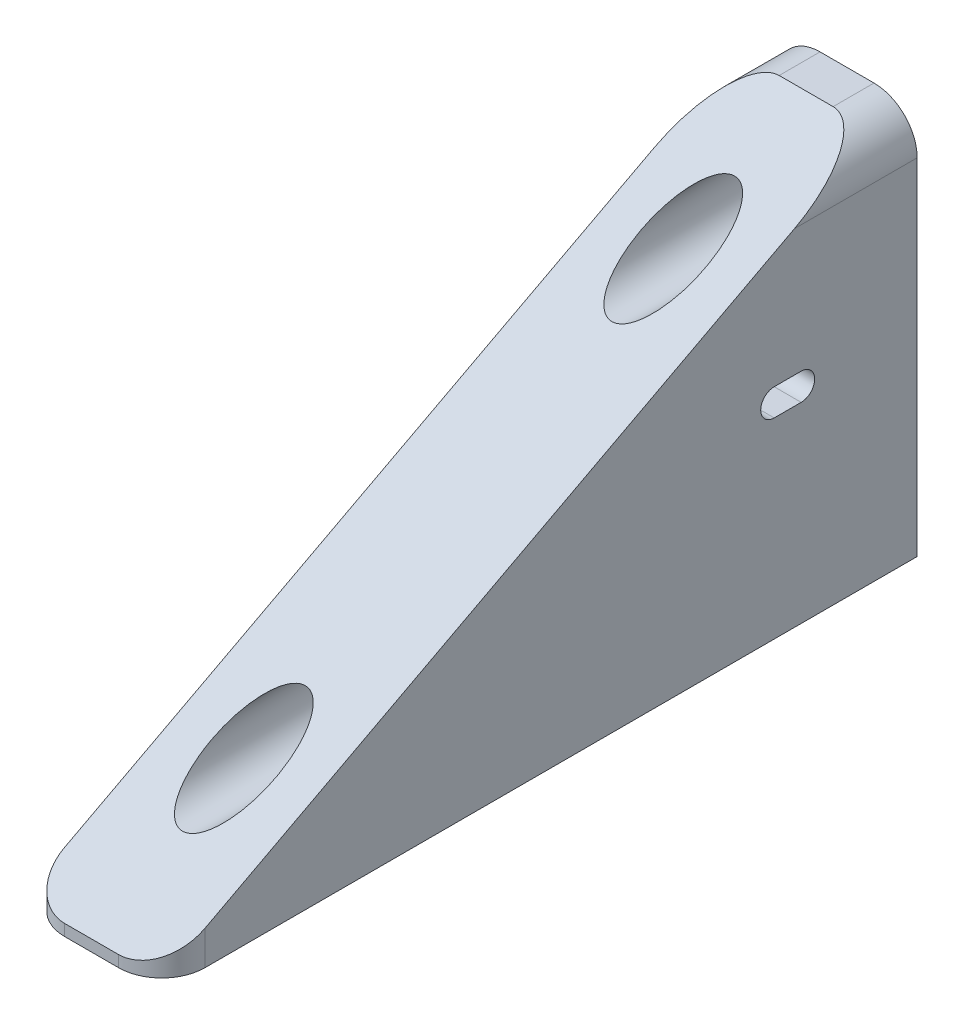
ISO-10303-21;
HEADER;
FILE_DESCRIPTION(('STEP AP214'),'2;1');
FILE_NAME('part.step','',(''),(''),'','','');
FILE_SCHEMA(('AUTOMOTIVE_DESIGN { 1 0 10303 214 1 1 1 1 }'));
ENDSEC;
DATA;
#1=APPLICATION_CONTEXT('core data for automotive mechanical design processes');
#2=APPLICATION_PROTOCOL_DEFINITION('international standard','automotive_design',2000,#1);
#3=PRODUCT_CONTEXT('',#1,'mechanical');
#4=PRODUCT('Part','Part','',(#3));
#5=PRODUCT_RELATED_PRODUCT_CATEGORY('part','',(#4));
#6=PRODUCT_DEFINITION_FORMATION('','',#4);
#7=PRODUCT_DEFINITION_CONTEXT('part definition',#1,'design');
#8=PRODUCT_DEFINITION('design','',#6,#7);
#9=PRODUCT_DEFINITION_SHAPE('','',#8);
#10=(LENGTH_UNIT() NAMED_UNIT(*) SI_UNIT(.MILLI.,.METRE.));
#11=(NAMED_UNIT(*) PLANE_ANGLE_UNIT() SI_UNIT($,.RADIAN.));
#12=(NAMED_UNIT(*) SI_UNIT($,.STERADIAN.) SOLID_ANGLE_UNIT());
#13=UNCERTAINTY_MEASURE_WITH_UNIT(LENGTH_MEASURE(1.E-05),#10,'distance_accuracy_value','');
#14=(GEOMETRIC_REPRESENTATION_CONTEXT(3) GLOBAL_UNCERTAINTY_ASSIGNED_CONTEXT((#13)) GLOBAL_UNIT_ASSIGNED_CONTEXT((#10,
#11,#12)) REPRESENTATION_CONTEXT('',''));
#15=CARTESIAN_POINT('',(0.,0.,0.));
#16=DIRECTION('',(0.,0.,1.));
#17=DIRECTION('',(1.,0.,0.));
#18=AXIS2_PLACEMENT_3D('',#15,#16,#17);
#19=CARTESIAN_POINT('',(6.5,-19.,72.));
#20=DIRECTION('',(0.,-0.884384752846969,-0.466758619558123));
#21=DIRECTION('',(0.,0.466758619558123,-0.88438475284697));
#22=AXIS2_PLACEMENT_3D('',#19,#20,#21);
#23=PLANE('',#22);
#24=DIRECTION('',(-1.,0.,0.));
#25=VECTOR('',#24,1.);
#26=CARTESIAN_POINT('',(6.5,17.,3.78947368421051));
#27=LINE('',#26,#25);
#28=CARTESIAN_POINT('',(2.5,17.,3.78947368421051));
#29=VERTEX_POINT('',#28);
#30=CARTESIAN_POINT('',(-2.5,17.,3.78947368421051));
#31=VERTEX_POINT('',#30);
#32=EDGE_CURVE('E225',#29,#31,#27,.T.);
#33=ORIENTED_EDGE('',*,*,#32,.T.);
#34=CARTESIAN_POINT('',(-2.5,13.,11.3684210526316));
#35=DIRECTION('',(0.,-0.884384752846969,-0.466758619558123));
#36=DIRECTION('',(0.,-0.466758619558123,0.88438475284697));
#37=AXIS2_PLACEMENT_3D('',#34,#35,#36);
#38=ELLIPSE('',#37,8.56973997349375,4.);
#39=CARTESIAN_POINT('',(-6.5,13.,11.3684210526316));
#40=VERTEX_POINT('',#39);
#41=EDGE_CURVE('E254',#31,#40,#38,.F.);
#42=ORIENTED_EDGE('',*,*,#41,.T.);
#43=DIRECTION('',(0.,-0.466758619558123,0.88438475284697));
#44=VECTOR('',#43,1.);
#45=CARTESIAN_POINT('',(-6.5,-19.,72.));
#46=LINE('',#45,#44);
#47=CARTESIAN_POINT('',(-6.5,-15.8333333333334,66.0000000000001));
#48=VERTEX_POINT('',#47);
#49=EDGE_CURVE('E190',#40,#48,#46,.T.);
#50=ORIENTED_EDGE('',*,*,#49,.T.);
#51=CARTESIAN_POINT('',(-2.5,-15.8333333333334,66.0000000000001));
#52=DIRECTION('',(0.,-0.884384752846969,-0.466758619558123));
#53=DIRECTION('',(0.,-0.466758619558123,0.88438475284697));
#54=AXIS2_PLACEMENT_3D('',#51,#52,#53);
#55=ELLIPSE('',#54,4.52291831934385,4.);
#56=CARTESIAN_POINT('',(-2.5,-17.9444444444445,70.));
#57=VERTEX_POINT('',#56);
#58=EDGE_CURVE('E248',#48,#57,#55,.F.);
#59=ORIENTED_EDGE('',*,*,#58,.T.);
#60=DIRECTION('',(1.,0.,0.));
#61=VECTOR('',#60,1.);
#62=CARTESIAN_POINT('',(6.5,-17.9444444444445,70.));
#63=LINE('',#62,#61);
#64=CARTESIAN_POINT('',(2.5,-17.9444444444445,70.));
#65=VERTEX_POINT('',#64);
#66=EDGE_CURVE('E228',#57,#65,#63,.T.);
#67=ORIENTED_EDGE('',*,*,#66,.T.);
#68=CARTESIAN_POINT('',(2.5,-15.8333333333334,66.0000000000001));
#69=DIRECTION('',(0.,-0.884384752846969,-0.466758619558123));
#70=DIRECTION('',(0.,-0.466758619558123,0.88438475284697));
#71=AXIS2_PLACEMENT_3D('',#68,#69,#70);
#72=ELLIPSE('',#71,4.52291831934385,4.);
#73=CARTESIAN_POINT('',(6.5,-15.8333333333334,66.0000000000001));
#74=VERTEX_POINT('',#73);
#75=EDGE_CURVE('E250',#65,#74,#72,.F.);
#76=ORIENTED_EDGE('',*,*,#75,.T.);
#77=DIRECTION('',(0.,-0.466758619558123,0.88438475284697));
#78=VECTOR('',#77,1.);
#79=CARTESIAN_POINT('',(6.5,-19.,72.));
#80=LINE('',#79,#78);
#81=CARTESIAN_POINT('',(6.5,13.,11.3684210526316));
#82=VERTEX_POINT('',#81);
#83=EDGE_CURVE('E195',#82,#74,#80,.T.);
#84=ORIENTED_EDGE('',*,*,#83,.F.);
#85=CARTESIAN_POINT('',(2.5,13.,11.3684210526316));
#86=DIRECTION('',(0.,-0.884384752846969,-0.466758619558123));
#87=DIRECTION('',(0.,-0.466758619558123,0.88438475284697));
#88=AXIS2_PLACEMENT_3D('',#85,#86,#87);
#89=ELLIPSE('',#88,8.56973997349375,4.);
#90=EDGE_CURVE('E252',#82,#29,#89,.F.);
#91=ORIENTED_EDGE('',*,*,#90,.T.);
#92=EDGE_LOOP('',(#33,#42,#50,#59,#67,#76,#84,#91));
#93=FACE_BOUND('',#92,.T.);
#94=CARTESIAN_POINT('',(0.,-10.5,55.8947368421052));
#95=DIRECTION('',(0.,-0.884384752846969,-0.466758619558123));
#96=DIRECTION('',(0.,0.466758619558123,-0.88438475284697));
#97=AXIS2_PLACEMENT_3D('',#94,#95,#96);
#98=ELLIPSE('',#97,6.4273049801203,3.);
#99=CARTESIAN_POINT('',(0.,-7.5,50.2105263157895));
#100=VERTEX_POINT('',#99);
#101=EDGE_CURVE('E219',#100,#100,#98,.T.);
#102=ORIENTED_EDGE('',*,*,#101,.T.);
#103=EDGE_LOOP('',(#102));
#104=FACE_BOUND('',#103,.T.);
#105=CARTESIAN_POINT('',(0.,10.5,16.1052631578947));
#106=DIRECTION('',(0.,-0.884384752846969,-0.466758619558123));
#107=DIRECTION('',(0.,0.466758619558123,-0.88438475284697));
#108=AXIS2_PLACEMENT_3D('',#105,#106,#107);
#109=ELLIPSE('',#108,6.4273049801203,3.);
#110=CARTESIAN_POINT('',(0.,13.5,10.4210526315789));
#111=VERTEX_POINT('',#110);
#112=EDGE_CURVE('E194',#111,#111,#109,.F.);
#113=ORIENTED_EDGE('',*,*,#112,.F.);
#114=EDGE_LOOP('',(#113));
#115=FACE_BOUND('',#114,.T.);
#116=ADVANCED_FACE('F43',(#93,#104,#115),#23,.F.);
#117=CARTESIAN_POINT('',(0.,10.5,72.));
#118=DIRECTION('',(0.,0.,-1.));
#119=DIRECTION('',(-1.,0.,0.));
#120=AXIS2_PLACEMENT_3D('',#117,#118,#119);
#121=CYLINDRICAL_SURFACE('',#120,1.575);
#122=CARTESIAN_POINT('',(0.,10.5,0.));
#123=DIRECTION('',(0.,0.,1.));
#124=DIRECTION('',(1.,0.,0.));
#125=AXIS2_PLACEMENT_3D('',#122,#123,#124);
#126=CIRCLE('',#125,1.575);
#127=CARTESIAN_POINT('',(1.575,10.5,0.));
#128=VERTEX_POINT('',#127);
#129=EDGE_CURVE('E187',#128,#128,#126,.T.);
#130=ORIENTED_EDGE('',*,*,#129,.F.);
#131=EDGE_LOOP('',(#130));
#132=FACE_BOUND('',#131,.T.);
#133=CARTESIAN_POINT('',(0.,10.5,5.));
#134=DIRECTION('',(0.,0.,1.));
#135=DIRECTION('',(1.,0.,0.));
#136=AXIS2_PLACEMENT_3D('',#133,#134,#135);
#137=CIRCLE('',#136,1.575);
#138=CARTESIAN_POINT('',(1.575,10.5,5.));
#139=VERTEX_POINT('',#138);
#140=EDGE_CURVE('E184',#139,#139,#137,.T.);
#141=ORIENTED_EDGE('',*,*,#140,.T.);
#142=EDGE_LOOP('',(#141));
#143=FACE_BOUND('',#142,.T.);
#144=ADVANCED_FACE('F302',(#132,#143),#121,.F.);
#145=CARTESIAN_POINT('',(6.5,19.,0.));
#146=DIRECTION('',(0.,0.,1.));
#147=DIRECTION('',(1.,0.,0.));
#148=AXIS2_PLACEMENT_3D('',#145,#146,#147);
#149=PLANE('',#148);
#150=CARTESIAN_POINT('',(0.,-10.5,0.));
#151=DIRECTION('',(0.,0.,-1.));
#152=DIRECTION('',(-1.,0.,0.));
#153=AXIS2_PLACEMENT_3D('',#150,#151,#152);
#154=CIRCLE('',#153,1.575);
#155=CARTESIAN_POINT('',(-1.575,-10.5,0.));
#156=VERTEX_POINT('',#155);
#157=EDGE_CURVE('E191',#156,#156,#154,.T.);
#158=ORIENTED_EDGE('',*,*,#157,.F.);
#159=EDGE_LOOP('',(#158));
#160=FACE_BOUND('',#159,.T.);
#161=DIRECTION('',(0.,1.,0.));
#162=VECTOR('',#161,1.);
#163=CARTESIAN_POINT('',(-6.5,19.,0.));
#164=LINE('',#163,#162);
#165=CARTESIAN_POINT('',(-6.5,-19.,0.));
#166=VERTEX_POINT('',#165);
#167=CARTESIAN_POINT('',(-6.5,13.,0.));
#168=VERTEX_POINT('',#167);
#169=EDGE_CURVE('E199',#166,#168,#164,.T.);
#170=ORIENTED_EDGE('',*,*,#169,.T.);
#171=CARTESIAN_POINT('',(-2.5,13.,0.));
#172=DIRECTION('',(0.,0.,1.));
#173=DIRECTION('',(1.,0.,0.));
#174=AXIS2_PLACEMENT_3D('',#171,#172,#173);
#175=CIRCLE('',#174,4.);
#176=CARTESIAN_POINT('',(-2.5,17.,0.));
#177=VERTEX_POINT('',#176);
#178=EDGE_CURVE('E242',#168,#177,#175,.F.);
#179=ORIENTED_EDGE('',*,*,#178,.T.);
#180=DIRECTION('',(1.,0.,0.));
#181=VECTOR('',#180,1.);
#182=CARTESIAN_POINT('',(6.5,17.,0.));
#183=LINE('',#182,#181);
#184=CARTESIAN_POINT('',(2.5,17.,0.));
#185=VERTEX_POINT('',#184);
#186=EDGE_CURVE('E231',#177,#185,#183,.T.);
#187=ORIENTED_EDGE('',*,*,#186,.T.);
#188=CARTESIAN_POINT('',(2.5,13.,0.));
#189=DIRECTION('',(0.,0.,1.));
#190=DIRECTION('',(1.,0.,0.));
#191=AXIS2_PLACEMENT_3D('',#188,#189,#190);
#192=CIRCLE('',#191,4.);
#193=CARTESIAN_POINT('',(6.5,13.,0.));
#194=VERTEX_POINT('',#193);
#195=EDGE_CURVE('E240',#185,#194,#192,.F.);
#196=ORIENTED_EDGE('',*,*,#195,.T.);
#197=DIRECTION('',(0.,1.,0.));
#198=VECTOR('',#197,1.);
#199=CARTESIAN_POINT('',(6.5,19.,0.));
#200=LINE('',#199,#198);
#201=CARTESIAN_POINT('',(6.5,-19.,0.));
#202=VERTEX_POINT('',#201);
#203=EDGE_CURVE('E201',#202,#194,#200,.T.);
#204=ORIENTED_EDGE('',*,*,#203,.F.);
#205=DIRECTION('',(-1.,0.,0.));
#206=VECTOR('',#205,1.);
#207=CARTESIAN_POINT('',(6.5,-19.,0.));
#208=LINE('',#207,#206);
#209=EDGE_CURVE('E204',#202,#166,#208,.T.);
#210=ORIENTED_EDGE('',*,*,#209,.T.);
#211=EDGE_LOOP('',(#170,#179,#187,#196,#204,#210));
#212=FACE_BOUND('',#211,.T.);
#213=ORIENTED_EDGE('',*,*,#129,.T.);
#214=EDGE_LOOP('',(#213));
#215=FACE_BOUND('',#214,.T.);
#216=ADVANCED_FACE('F299',(#160,#212,#215),#149,.F.);
#217=CARTESIAN_POINT('',(6.5,-19.,0.));
#218=DIRECTION('',(0.,1.,0.));
#219=DIRECTION('',(0.,0.,1.));
#220=AXIS2_PLACEMENT_3D('',#217,#218,#219);
#221=PLANE('',#220);
#222=DIRECTION('',(0.,0.,-1.));
#223=VECTOR('',#222,1.);
#224=CARTESIAN_POINT('',(6.5,-19.,0.));
#225=LINE('',#224,#223);
#226=CARTESIAN_POINT('',(6.5,-19.,66.));
#227=VERTEX_POINT('',#226);
#228=EDGE_CURVE('E198',#227,#202,#225,.T.);
#229=ORIENTED_EDGE('',*,*,#228,.F.);
#230=CARTESIAN_POINT('',(2.5,-19.,66.));
#231=DIRECTION('',(0.,1.,0.));
#232=DIRECTION('',(0.,0.,1.));
#233=AXIS2_PLACEMENT_3D('',#230,#231,#232);
#234=CIRCLE('',#233,4.);
#235=CARTESIAN_POINT('',(2.5,-19.,70.));
#236=VERTEX_POINT('',#235);
#237=EDGE_CURVE('E64',#227,#236,#234,.F.);
#238=ORIENTED_EDGE('',*,*,#237,.T.);
#239=DIRECTION('',(-1.,0.,0.));
#240=VECTOR('',#239,1.);
#241=CARTESIAN_POINT('',(6.5,-19.,70.));
#242=LINE('',#241,#240);
#243=CARTESIAN_POINT('',(-2.5,-19.,70.));
#244=VERTEX_POINT('',#243);
#245=EDGE_CURVE('E213',#236,#244,#242,.T.);
#246=ORIENTED_EDGE('',*,*,#245,.T.);
#247=CARTESIAN_POINT('',(-2.5,-19.,66.));
#248=DIRECTION('',(0.,1.,0.));
#249=DIRECTION('',(0.,0.,1.));
#250=AXIS2_PLACEMENT_3D('',#247,#248,#249);
#251=CIRCLE('',#250,4.);
#252=CARTESIAN_POINT('',(-6.5,-19.,66.));
#253=VERTEX_POINT('',#252);
#254=EDGE_CURVE('E262',#244,#253,#251,.F.);
#255=ORIENTED_EDGE('',*,*,#254,.T.);
#256=DIRECTION('',(0.,0.,-1.));
#257=VECTOR('',#256,1.);
#258=CARTESIAN_POINT('',(-6.5,-19.,0.));
#259=LINE('',#258,#257);
#260=EDGE_CURVE('E207',#253,#166,#259,.T.);
#261=ORIENTED_EDGE('',*,*,#260,.T.);
#262=ORIENTED_EDGE('',*,*,#209,.F.);
#263=EDGE_LOOP('',(#229,#238,#246,#255,#261,#262));
#264=FACE_BOUND('',#263,.T.);
#265=ADVANCED_FACE('F266',(#264),#221,.F.);
#266=CARTESIAN_POINT('',(6.5,0.,0.));
#267=DIRECTION('',(-1.,0.,0.));
#268=DIRECTION('',(0.,0.,1.));
#269=AXIS2_PLACEMENT_3D('',#266,#267,#268);
#270=PLANE('',#269);
#271=DIRECTION('',(0.,0.,-1.));
#272=VECTOR('',#271,1.);
#273=CARTESIAN_POINT('',(6.5,-1.25,13.25));
#274=LINE('',#273,#272);
#275=CARTESIAN_POINT('',(6.5,-1.25,13.25));
#276=VERTEX_POINT('',#275);
#277=CARTESIAN_POINT('',(6.5,-1.25,10.75));
#278=VERTEX_POINT('',#277);
#279=EDGE_CURVE('E153',#276,#278,#274,.T.);
#280=ORIENTED_EDGE('',*,*,#279,.F.);
#281=CARTESIAN_POINT('',(6.5,0.,13.25));
#282=DIRECTION('',(1.,0.,0.));
#283=DIRECTION('',(0.,0.,-1.));
#284=AXIS2_PLACEMENT_3D('',#281,#282,#283);
#285=CIRCLE('',#284,1.25);
#286=CARTESIAN_POINT('',(6.5,1.25,13.25));
#287=VERTEX_POINT('',#286);
#288=EDGE_CURVE('E157',#287,#276,#285,.T.);
#289=ORIENTED_EDGE('',*,*,#288,.F.);
#290=DIRECTION('',(0.,0.,1.));
#291=VECTOR('',#290,1.);
#292=CARTESIAN_POINT('',(6.5,1.25,13.25));
#293=LINE('',#292,#291);
#294=CARTESIAN_POINT('',(6.5,1.25,10.75));
#295=VERTEX_POINT('',#294);
#296=EDGE_CURVE('E162',#295,#287,#293,.T.);
#297=ORIENTED_EDGE('',*,*,#296,.F.);
#298=CARTESIAN_POINT('',(6.5,0.,10.75));
#299=DIRECTION('',(1.,0.,0.));
#300=DIRECTION('',(0.,0.,-1.));
#301=AXIS2_PLACEMENT_3D('',#298,#299,#300);
#302=CIRCLE('',#301,1.25);
#303=EDGE_CURVE('E141',#278,#295,#302,.T.);
#304=ORIENTED_EDGE('',*,*,#303,.F.);
#305=EDGE_LOOP('',(#280,#289,#297,#304));
#306=FACE_BOUND('',#305,.T.);
#307=ORIENTED_EDGE('',*,*,#203,.T.);
#308=DIRECTION('',(0.,0.,-1.));
#309=VECTOR('',#308,1.);
#310=CARTESIAN_POINT('',(6.5,13.,3.78947368421051));
#311=LINE('',#310,#309);
#312=EDGE_CURVE('E259',#194,#82,#311,.F.);
#313=ORIENTED_EDGE('',*,*,#312,.T.);
#314=ORIENTED_EDGE('',*,*,#83,.T.);
#315=DIRECTION('',(0.,1.,0.));
#316=VECTOR('',#315,1.);
#317=CARTESIAN_POINT('',(6.5,-18.9999999999999,66.));
#318=LINE('',#317,#316);
#319=EDGE_CURVE('E256',#74,#227,#318,.F.);
#320=ORIENTED_EDGE('',*,*,#319,.T.);
#321=ORIENTED_EDGE('',*,*,#228,.T.);
#322=EDGE_LOOP('',(#307,#313,#314,#320,#321));
#323=FACE_BOUND('',#322,.T.);
#324=ADVANCED_FACE('F159',(#306,#323),#270,.F.);
#325=CARTESIAN_POINT('',(-6.5,0.,0.));
#326=DIRECTION('',(-1.,0.,0.));
#327=DIRECTION('',(0.,0.,1.));
#328=AXIS2_PLACEMENT_3D('',#325,#326,#327);
#329=PLANE('',#328);
#330=CARTESIAN_POINT('',(-6.5,0.,13.25));
#331=DIRECTION('',(1.,0.,0.));
#332=DIRECTION('',(0.,0.,-1.));
#333=AXIS2_PLACEMENT_3D('',#330,#331,#332);
#334=CIRCLE('',#333,1.25);
#335=CARTESIAN_POINT('',(-6.5,1.25,13.25));
#336=VERTEX_POINT('',#335);
#337=CARTESIAN_POINT('',(-6.5,-1.25,13.25));
#338=VERTEX_POINT('',#337);
#339=EDGE_CURVE('E164',#336,#338,#334,.T.);
#340=ORIENTED_EDGE('',*,*,#339,.T.);
#341=DIRECTION('',(0.,0.,-1.));
#342=VECTOR('',#341,1.);
#343=CARTESIAN_POINT('',(-6.5,-1.25,13.25));
#344=LINE('',#343,#342);
#345=CARTESIAN_POINT('',(-6.5,-1.25,10.75));
#346=VERTEX_POINT('',#345);
#347=EDGE_CURVE('E170',#338,#346,#344,.T.);
#348=ORIENTED_EDGE('',*,*,#347,.T.);
#349=CARTESIAN_POINT('',(-6.5,0.,10.75));
#350=DIRECTION('',(1.,0.,0.));
#351=DIRECTION('',(0.,0.,-1.));
#352=AXIS2_PLACEMENT_3D('',#349,#350,#351);
#353=CIRCLE('',#352,1.25);
#354=CARTESIAN_POINT('',(-6.5,1.25,10.75));
#355=VERTEX_POINT('',#354);
#356=EDGE_CURVE('E144',#346,#355,#353,.T.);
#357=ORIENTED_EDGE('',*,*,#356,.T.);
#358=DIRECTION('',(0.,0.,1.));
#359=VECTOR('',#358,1.);
#360=CARTESIAN_POINT('',(-6.5,1.25,13.25));
#361=LINE('',#360,#359);
#362=EDGE_CURVE('E173',#355,#336,#361,.T.);
#363=ORIENTED_EDGE('',*,*,#362,.T.);
#364=EDGE_LOOP('',(#340,#348,#357,#363));
#365=FACE_BOUND('',#364,.T.);
#366=ORIENTED_EDGE('',*,*,#49,.F.);
#367=DIRECTION('',(0.,0.,1.));
#368=VECTOR('',#367,1.);
#369=CARTESIAN_POINT('',(-6.5,13.,0.));
#370=LINE('',#369,#368);
#371=EDGE_CURVE('E237',#40,#168,#370,.F.);
#372=ORIENTED_EDGE('',*,*,#371,.T.);
#373=ORIENTED_EDGE('',*,*,#169,.F.);
#374=ORIENTED_EDGE('',*,*,#260,.F.);
#375=DIRECTION('',(0.,-1.,0.));
#376=VECTOR('',#375,1.);
#377=CARTESIAN_POINT('',(-6.5,-1.73545388586145E-12,66.0000000000005));
#378=LINE('',#377,#376);
#379=EDGE_CURVE('E234',#253,#48,#378,.F.);
#380=ORIENTED_EDGE('',*,*,#379,.T.);
#381=EDGE_LOOP('',(#366,#372,#373,#374,#380));
#382=FACE_BOUND('',#381,.T.);
#383=ADVANCED_FACE('F273',(#365,#382),#329,.T.);
#384=CARTESIAN_POINT('',(0.,-10.5,72.));
#385=DIRECTION('',(0.,0.,-1.));
#386=DIRECTION('',(-1.,0.,0.));
#387=AXIS2_PLACEMENT_3D('',#384,#385,#386);
#388=CYLINDRICAL_SURFACE('',#387,1.575);
#389=CARTESIAN_POINT('',(0.,-10.5,5.));
#390=DIRECTION('',(0.,0.,-1.));
#391=DIRECTION('',(-1.,0.,0.));
#392=AXIS2_PLACEMENT_3D('',#389,#390,#391);
#393=CIRCLE('',#392,1.575);
#394=CARTESIAN_POINT('',(-1.575,-10.5,5.));
#395=VERTEX_POINT('',#394);
#396=EDGE_CURVE('E216',#395,#395,#393,.F.);
#397=ORIENTED_EDGE('',*,*,#396,.T.);
#398=EDGE_LOOP('',(#397));
#399=FACE_BOUND('',#398,.T.);
#400=ORIENTED_EDGE('',*,*,#157,.T.);
#401=EDGE_LOOP('',(#400));
#402=FACE_BOUND('',#401,.T.);
#403=ADVANCED_FACE('F322',(#399,#402),#388,.F.);
#404=CARTESIAN_POINT('',(0.,10.5,72.));
#405=DIRECTION('',(0.,0.,-1.));
#406=DIRECTION('',(-1.,0.,0.));
#407=AXIS2_PLACEMENT_3D('',#404,#405,#406);
#408=CYLINDRICAL_SURFACE('',#407,3.);
#409=CARTESIAN_POINT('',(0.,10.5,5.));
#410=DIRECTION('',(0.,0.,1.));
#411=DIRECTION('',(1.,0.,0.));
#412=AXIS2_PLACEMENT_3D('',#409,#410,#411);
#413=CIRCLE('',#412,3.);
#414=CARTESIAN_POINT('',(3.,10.5,5.));
#415=VERTEX_POINT('',#414);
#416=EDGE_CURVE('E181',#415,#415,#413,.T.);
#417=ORIENTED_EDGE('',*,*,#416,.F.);
#418=EDGE_LOOP('',(#417));
#419=FACE_BOUND('',#418,.T.);
#420=ORIENTED_EDGE('',*,*,#112,.T.);
#421=EDGE_LOOP('',(#420));
#422=FACE_BOUND('',#421,.T.);
#423=ADVANCED_FACE('F316',(#419,#422),#408,.F.);
#424=CARTESIAN_POINT('',(0.,10.5,5.));
#425=DIRECTION('',(0.,0.,1.));
#426=DIRECTION('',(1.,0.,0.));
#427=AXIS2_PLACEMENT_3D('',#424,#425,#426);
#428=PLANE('',#427);
#429=ORIENTED_EDGE('',*,*,#140,.F.);
#430=EDGE_LOOP('',(#429));
#431=FACE_BOUND('',#430,.T.);
#432=ORIENTED_EDGE('',*,*,#416,.T.);
#433=EDGE_LOOP('',(#432));
#434=FACE_BOUND('',#433,.T.);
#435=ADVANCED_FACE('F312',(#431,#434),#428,.T.);
#436=CARTESIAN_POINT('',(0.,-10.5,72.));
#437=DIRECTION('',(0.,0.,-1.));
#438=DIRECTION('',(-1.,0.,0.));
#439=AXIS2_PLACEMENT_3D('',#436,#437,#438);
#440=CYLINDRICAL_SURFACE('',#439,3.);
#441=CARTESIAN_POINT('',(0.,-10.5,5.));
#442=DIRECTION('',(0.,0.,-1.));
#443=DIRECTION('',(-1.,0.,0.));
#444=AXIS2_PLACEMENT_3D('',#441,#442,#443);
#445=CIRCLE('',#444,3.);
#446=CARTESIAN_POINT('',(-3.,-10.5,5.));
#447=VERTEX_POINT('',#446);
#448=EDGE_CURVE('E178',#447,#447,#445,.T.);
#449=ORIENTED_EDGE('',*,*,#448,.T.);
#450=EDGE_LOOP('',(#449));
#451=FACE_BOUND('',#450,.T.);
#452=ORIENTED_EDGE('',*,*,#101,.F.);
#453=EDGE_LOOP('',(#452));
#454=FACE_BOUND('',#453,.T.);
#455=ADVANCED_FACE('F315',(#451,#454),#440,.F.);
#456=CARTESIAN_POINT('',(0.,-10.5,5.));
#457=DIRECTION('',(0.,0.,-1.));
#458=DIRECTION('',(-1.,0.,0.));
#459=AXIS2_PLACEMENT_3D('',#456,#457,#458);
#460=PLANE('',#459);
#461=ORIENTED_EDGE('',*,*,#448,.F.);
#462=EDGE_LOOP('',(#461));
#463=FACE_BOUND('',#462,.T.);
#464=ORIENTED_EDGE('',*,*,#396,.F.);
#465=EDGE_LOOP('',(#464));
#466=FACE_BOUND('',#465,.T.);
#467=ADVANCED_FACE('F417',(#463,#466),#460,.F.);
#468=CARTESIAN_POINT('',(-6.5,0.,13.25));
#469=DIRECTION('',(1.,0.,0.));
#470=DIRECTION('',(0.,0.,-1.));
#471=AXIS2_PLACEMENT_3D('',#468,#469,#470);
#472=CYLINDRICAL_SURFACE('',#471,1.25);
#473=DIRECTION('',(1.,0.,0.));
#474=VECTOR('',#473,1.);
#475=CARTESIAN_POINT('',(-6.5,-1.25,13.25));
#476=LINE('',#475,#474);
#477=EDGE_CURVE('E149',#338,#276,#476,.T.);
#478=ORIENTED_EDGE('',*,*,#477,.F.);
#479=ORIENTED_EDGE('',*,*,#339,.F.);
#480=DIRECTION('',(1.,0.,0.));
#481=VECTOR('',#480,1.);
#482=CARTESIAN_POINT('',(-6.5,1.25,13.25));
#483=LINE('',#482,#481);
#484=EDGE_CURVE('E176',#336,#287,#483,.T.);
#485=ORIENTED_EDGE('',*,*,#484,.T.);
#486=ORIENTED_EDGE('',*,*,#288,.T.);
#487=EDGE_LOOP('',(#478,#479,#485,#486));
#488=FACE_BOUND('',#487,.T.);
#489=ADVANCED_FACE('F407',(#488),#472,.F.);
#490=CARTESIAN_POINT('',(-6.5,1.25,13.25));
#491=DIRECTION('',(0.,1.,0.));
#492=DIRECTION('',(0.,0.,1.));
#493=AXIS2_PLACEMENT_3D('',#490,#491,#492);
#494=PLANE('',#493);
#495=ORIENTED_EDGE('',*,*,#484,.F.);
#496=ORIENTED_EDGE('',*,*,#362,.F.);
#497=DIRECTION('',(1.,0.,0.));
#498=VECTOR('',#497,1.);
#499=CARTESIAN_POINT('',(-6.5,1.25,10.75));
#500=LINE('',#499,#498);
#501=EDGE_CURVE('E148',#355,#295,#500,.T.);
#502=ORIENTED_EDGE('',*,*,#501,.T.);
#503=ORIENTED_EDGE('',*,*,#296,.T.);
#504=EDGE_LOOP('',(#495,#496,#502,#503));
#505=FACE_BOUND('',#504,.T.);
#506=ADVANCED_FACE('F398',(#505),#494,.F.);
#507=CARTESIAN_POINT('',(-6.5,0.,10.75));
#508=DIRECTION('',(1.,0.,0.));
#509=DIRECTION('',(0.,0.,-1.));
#510=AXIS2_PLACEMENT_3D('',#507,#508,#509);
#511=CYLINDRICAL_SURFACE('',#510,1.25);
#512=ORIENTED_EDGE('',*,*,#501,.F.);
#513=ORIENTED_EDGE('',*,*,#356,.F.);
#514=DIRECTION('',(1.,0.,0.));
#515=VECTOR('',#514,1.);
#516=CARTESIAN_POINT('',(-6.5,-1.25,10.75));
#517=LINE('',#516,#515);
#518=EDGE_CURVE('E137',#346,#278,#517,.T.);
#519=ORIENTED_EDGE('',*,*,#518,.T.);
#520=ORIENTED_EDGE('',*,*,#303,.T.);
#521=EDGE_LOOP('',(#512,#513,#519,#520));
#522=FACE_BOUND('',#521,.T.);
#523=ADVANCED_FACE('F139',(#522),#511,.F.);
#524=CARTESIAN_POINT('',(-6.5,-1.25,13.25));
#525=DIRECTION('',(0.,-1.,0.));
#526=DIRECTION('',(0.,0.,-1.));
#527=AXIS2_PLACEMENT_3D('',#524,#525,#526);
#528=PLANE('',#527);
#529=ORIENTED_EDGE('',*,*,#518,.F.);
#530=ORIENTED_EDGE('',*,*,#347,.F.);
#531=ORIENTED_EDGE('',*,*,#477,.T.);
#532=ORIENTED_EDGE('',*,*,#279,.T.);
#533=EDGE_LOOP('',(#529,#530,#531,#532));
#534=FACE_BOUND('',#533,.T.);
#535=ADVANCED_FACE('F154',(#534),#528,.F.);
#536=CARTESIAN_POINT('',(6.5,-19.,70.));
#537=DIRECTION('',(0.,0.,-1.));
#538=DIRECTION('',(-1.,0.,0.));
#539=AXIS2_PLACEMENT_3D('',#536,#537,#538);
#540=PLANE('',#539);
#541=ORIENTED_EDGE('',*,*,#245,.F.);
#542=DIRECTION('',(0.,-1.,0.));
#543=VECTOR('',#542,1.);
#544=CARTESIAN_POINT('',(2.5,-17.9444444444445,70.));
#545=LINE('',#544,#543);
#546=EDGE_CURVE('E11',#236,#65,#545,.F.);
#547=ORIENTED_EDGE('',*,*,#546,.T.);
#548=ORIENTED_EDGE('',*,*,#66,.F.);
#549=DIRECTION('',(0.,1.,0.));
#550=VECTOR('',#549,1.);
#551=CARTESIAN_POINT('',(-2.5,-19.,70.));
#552=LINE('',#551,#550);
#553=EDGE_CURVE('E51',#57,#244,#552,.F.);
#554=ORIENTED_EDGE('',*,*,#553,.T.);
#555=EDGE_LOOP('',(#541,#547,#548,#554));
#556=FACE_BOUND('',#555,.T.);
#557=ADVANCED_FACE('F277',(#556),#540,.F.);
#558=CARTESIAN_POINT('',(6.5,17.,3.78947368421052));
#559=DIRECTION('',(0.,-1.,0.));
#560=DIRECTION('',(-1.,0.,0.));
#561=AXIS2_PLACEMENT_3D('',#558,#559,#560);
#562=PLANE('',#561);
#563=ORIENTED_EDGE('',*,*,#186,.F.);
#564=DIRECTION('',(0.,0.,-1.));
#565=VECTOR('',#564,1.);
#566=CARTESIAN_POINT('',(-2.5,17.,3.78947368421052));
#567=LINE('',#566,#565);
#568=EDGE_CURVE('E246',#177,#31,#567,.F.);
#569=ORIENTED_EDGE('',*,*,#568,.T.);
#570=ORIENTED_EDGE('',*,*,#32,.F.);
#571=DIRECTION('',(0.,0.,1.));
#572=VECTOR('',#571,1.);
#573=CARTESIAN_POINT('',(2.5,17.,0.));
#574=LINE('',#573,#572);
#575=EDGE_CURVE('E244',#29,#185,#574,.F.);
#576=ORIENTED_EDGE('',*,*,#575,.T.);
#577=EDGE_LOOP('',(#563,#569,#570,#576));
#578=FACE_BOUND('',#577,.T.);
#579=ADVANCED_FACE('F293',(#578),#562,.F.);
#580=CARTESIAN_POINT('',(-2.5,13.,0.));
#581=DIRECTION('',(0.,0.,1.));
#582=DIRECTION('',(0.,-1.,0.));
#583=AXIS2_PLACEMENT_3D('',#580,#581,#582);
#584=CYLINDRICAL_SURFACE('',#583,4.);
#585=ORIENTED_EDGE('',*,*,#41,.F.);
#586=ORIENTED_EDGE('',*,*,#568,.F.);
#587=ORIENTED_EDGE('',*,*,#178,.F.);
#588=ORIENTED_EDGE('',*,*,#371,.F.);
#589=EDGE_LOOP('',(#585,#586,#587,#588));
#590=FACE_BOUND('',#589,.T.);
#591=ADVANCED_FACE('F296',(#590),#584,.T.);
#592=CARTESIAN_POINT('',(2.5,13.,0.));
#593=DIRECTION('',(0.,0.,1.));
#594=DIRECTION('',(0.,-1.,0.));
#595=AXIS2_PLACEMENT_3D('',#592,#593,#594);
#596=CYLINDRICAL_SURFACE('',#595,4.);
#597=ORIENTED_EDGE('',*,*,#195,.F.);
#598=ORIENTED_EDGE('',*,*,#575,.F.);
#599=ORIENTED_EDGE('',*,*,#90,.F.);
#600=ORIENTED_EDGE('',*,*,#312,.F.);
#601=EDGE_LOOP('',(#597,#598,#599,#600));
#602=FACE_BOUND('',#601,.T.);
#603=ADVANCED_FACE('F287',(#602),#596,.T.);
#604=CARTESIAN_POINT('',(2.5,-1.73545388586145E-12,66.0000000000005));
#605=DIRECTION('',(0.,-1.,0.));
#606=DIRECTION('',(0.,0.,-1.));
#607=AXIS2_PLACEMENT_3D('',#604,#605,#606);
#608=CYLINDRICAL_SURFACE('',#607,4.);
#609=ORIENTED_EDGE('',*,*,#75,.F.);
#610=ORIENTED_EDGE('',*,*,#546,.F.);
#611=ORIENTED_EDGE('',*,*,#237,.F.);
#612=ORIENTED_EDGE('',*,*,#319,.F.);
#613=EDGE_LOOP('',(#609,#610,#611,#612));
#614=FACE_BOUND('',#613,.T.);
#615=ADVANCED_FACE('F280',(#614),#608,.T.);
#616=CARTESIAN_POINT('',(-2.5,-1.73545388586145E-12,66.0000000000005));
#617=DIRECTION('',(0.,-1.,0.));
#618=DIRECTION('',(0.,0.,-1.));
#619=AXIS2_PLACEMENT_3D('',#616,#617,#618);
#620=CYLINDRICAL_SURFACE('',#619,4.);
#621=ORIENTED_EDGE('',*,*,#254,.F.);
#622=ORIENTED_EDGE('',*,*,#553,.F.);
#623=ORIENTED_EDGE('',*,*,#58,.F.);
#624=ORIENTED_EDGE('',*,*,#379,.F.);
#625=EDGE_LOOP('',(#621,#622,#623,#624));
#626=FACE_BOUND('',#625,.T.);
#627=ADVANCED_FACE('F45',(#626),#620,.T.);
#628=CLOSED_SHELL('',(#116,#144,#216,#265,#324,#383,#403,#423,#435,#455,#467,#489,#506,#523,
#535,#557,#579,#591,#603,#615,#627));
#629=MANIFOLD_SOLID_BREP('B2',#628);
#630=ADVANCED_BREP_SHAPE_REPRESENTATION('',(#18,#629),#14);
#631=SHAPE_DEFINITION_REPRESENTATION(#9,#630);
ENDSEC;
END-ISO-10303-21;
